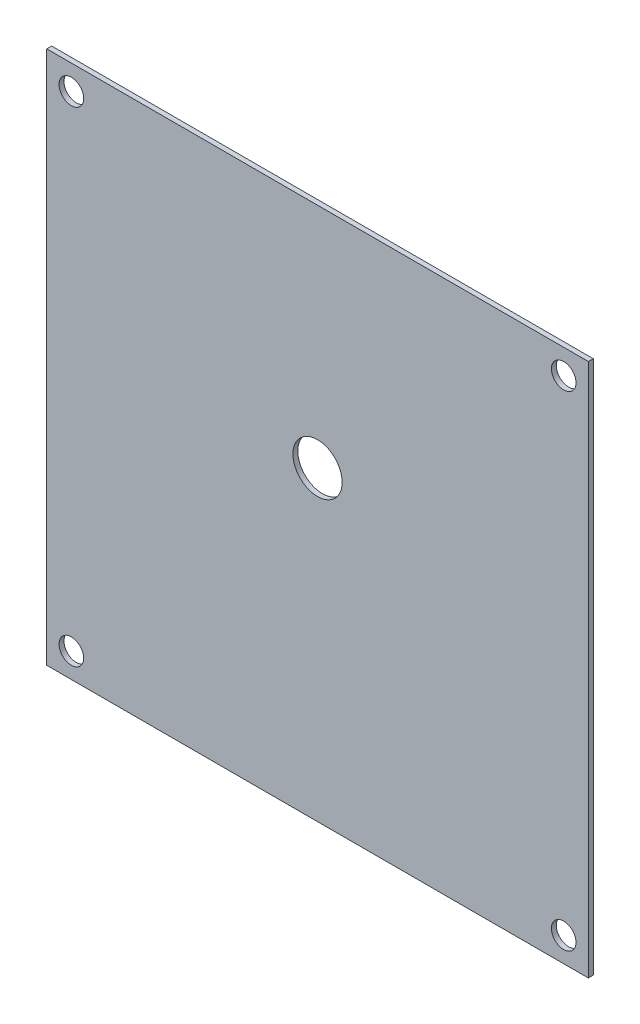
ISO-10303-21;
HEADER;
FILE_DESCRIPTION(('STEP AP214'),'2;1');
FILE_NAME('part.step','',(''),(''),'','','');
FILE_SCHEMA(('AUTOMOTIVE_DESIGN { 1 0 10303 214 1 1 1 1 }'));
ENDSEC;
DATA;
#1=APPLICATION_CONTEXT('core data for automotive mechanical design processes');
#2=APPLICATION_PROTOCOL_DEFINITION('international standard','automotive_design',2000,#1);
#3=PRODUCT_CONTEXT('',#1,'mechanical');
#4=PRODUCT('Part','Part','',(#3));
#5=PRODUCT_RELATED_PRODUCT_CATEGORY('part','',(#4));
#6=PRODUCT_DEFINITION_FORMATION('','',#4);
#7=PRODUCT_DEFINITION_CONTEXT('part definition',#1,'design');
#8=PRODUCT_DEFINITION('design','',#6,#7);
#9=PRODUCT_DEFINITION_SHAPE('','',#8);
#10=(LENGTH_UNIT() NAMED_UNIT(*) SI_UNIT(.MILLI.,.METRE.));
#11=(NAMED_UNIT(*) PLANE_ANGLE_UNIT() SI_UNIT($,.RADIAN.));
#12=(NAMED_UNIT(*) SI_UNIT($,.STERADIAN.) SOLID_ANGLE_UNIT());
#13=UNCERTAINTY_MEASURE_WITH_UNIT(LENGTH_MEASURE(1.E-05),#10,'distance_accuracy_value','');
#14=(GEOMETRIC_REPRESENTATION_CONTEXT(3) GLOBAL_UNCERTAINTY_ASSIGNED_CONTEXT((#13)) GLOBAL_UNIT_ASSIGNED_CONTEXT((#10,
#11,#12)) REPRESENTATION_CONTEXT('',''));
#15=CARTESIAN_POINT('',(0.,0.,0.));
#16=DIRECTION('',(0.,0.,1.));
#17=DIRECTION('',(1.,0.,0.));
#18=AXIS2_PLACEMENT_3D('',#15,#16,#17);
#19=CARTESIAN_POINT('',(0.,0.,2.54));
#20=DIRECTION('',(0.,0.,1.));
#21=DIRECTION('',(1.,0.,0.));
#22=AXIS2_PLACEMENT_3D('',#19,#20,#21);
#23=PLANE('',#22);
#24=CARTESIAN_POINT('',(127.,125.015625,2.54));
#25=DIRECTION('',(0.,0.,1.));
#26=DIRECTION('',(-1.,0.,0.));
#27=AXIS2_PLACEMENT_3D('',#24,#25,#26);
#28=CIRCLE('',#27,6.34999999999999);
#29=CARTESIAN_POINT('',(120.65,125.015625,2.54));
#30=VERTEX_POINT('',#29);
#31=EDGE_CURVE('E135',#30,#30,#28,.T.);
#32=ORIENTED_EDGE('',*,*,#31,.F.);
#33=EDGE_LOOP('',(#32));
#34=FACE_BOUND('',#33,.T.);
#35=CARTESIAN_POINT('',(-127.,-125.015625,2.54));
#36=DIRECTION('',(0.,0.,1.));
#37=DIRECTION('',(-1.,0.,0.));
#38=AXIS2_PLACEMENT_3D('',#35,#36,#37);
#39=CIRCLE('',#38,6.34999999999999);
#40=CARTESIAN_POINT('',(-133.35,-125.015625,2.54));
#41=VERTEX_POINT('',#40);
#42=EDGE_CURVE('E123',#41,#41,#39,.T.);
#43=ORIENTED_EDGE('',*,*,#42,.F.);
#44=EDGE_LOOP('',(#43));
#45=FACE_BOUND('',#44,.T.);
#46=DIRECTION('',(0.,1.,0.));
#47=VECTOR('',#46,1.);
#48=CARTESIAN_POINT('',(139.7,137.715625,2.54));
#49=LINE('',#48,#47);
#50=CARTESIAN_POINT('',(139.7,-137.715625,2.54));
#51=VERTEX_POINT('',#50);
#52=CARTESIAN_POINT('',(139.7,137.715625,2.54));
#53=VERTEX_POINT('',#52);
#54=EDGE_CURVE('E93',#51,#53,#49,.T.);
#55=ORIENTED_EDGE('',*,*,#54,.T.);
#56=DIRECTION('',(-1.,0.,0.));
#57=VECTOR('',#56,1.);
#58=CARTESIAN_POINT('',(-139.7,137.715625,2.54));
#59=LINE('',#58,#57);
#60=CARTESIAN_POINT('',(-139.7,137.715625,2.54));
#61=VERTEX_POINT('',#60);
#62=EDGE_CURVE('E88',#53,#61,#59,.T.);
#63=ORIENTED_EDGE('',*,*,#62,.T.);
#64=DIRECTION('',(0.,-1.,0.));
#65=VECTOR('',#64,1.);
#66=CARTESIAN_POINT('',(-139.7,137.715625,2.54));
#67=LINE('',#66,#65);
#68=CARTESIAN_POINT('',(-139.7,-137.715625,2.54));
#69=VERTEX_POINT('',#68);
#70=EDGE_CURVE('E91',#61,#69,#67,.T.);
#71=ORIENTED_EDGE('',*,*,#70,.T.);
#72=DIRECTION('',(1.,0.,0.));
#73=VECTOR('',#72,1.);
#74=CARTESIAN_POINT('',(-139.7,-137.715625,2.54));
#75=LINE('',#74,#73);
#76=EDGE_CURVE('E58',#69,#51,#75,.T.);
#77=ORIENTED_EDGE('',*,*,#76,.T.);
#78=EDGE_LOOP('',(#55,#63,#71,#77));
#79=FACE_BOUND('',#78,.T.);
#80=CARTESIAN_POINT('',(-127.,125.015625,2.54));
#81=DIRECTION('',(0.,0.,1.));
#82=DIRECTION('',(1.,0.,0.));
#83=AXIS2_PLACEMENT_3D('',#80,#81,#82);
#84=CIRCLE('',#83,6.34999999999999);
#85=CARTESIAN_POINT('',(-120.65,125.015625,2.54));
#86=VERTEX_POINT('',#85);
#87=EDGE_CURVE('E108',#86,#86,#84,.T.);
#88=ORIENTED_EDGE('',*,*,#87,.F.);
#89=EDGE_LOOP('',(#88));
#90=FACE_BOUND('',#89,.T.);
#91=CARTESIAN_POINT('',(127.,-125.015625,2.54));
#92=DIRECTION('',(0.,0.,1.));
#93=DIRECTION('',(1.,0.,0.));
#94=AXIS2_PLACEMENT_3D('',#91,#92,#93);
#95=CIRCLE('',#94,6.34999999999999);
#96=CARTESIAN_POINT('',(133.35,-125.015625,2.54));
#97=VERTEX_POINT('',#96);
#98=EDGE_CURVE('E129',#97,#97,#95,.T.);
#99=ORIENTED_EDGE('',*,*,#98,.F.);
#100=EDGE_LOOP('',(#99));
#101=FACE_BOUND('',#100,.T.);
#102=CARTESIAN_POINT('',(0.,20.240625,2.54));
#103=DIRECTION('',(0.,0.,1.));
#104=DIRECTION('',(1.,0.,0.));
#105=AXIS2_PLACEMENT_3D('',#102,#103,#104);
#106=CIRCLE('',#105,12.7);
#107=CARTESIAN_POINT('',(12.7,20.240625,2.54));
#108=VERTEX_POINT('',#107);
#109=EDGE_CURVE('E141',#108,#108,#106,.T.);
#110=ORIENTED_EDGE('',*,*,#109,.F.);
#111=EDGE_LOOP('',(#110));
#112=FACE_BOUND('',#111,.T.);
#113=ADVANCED_FACE('F41',(#34,#45,#79,#90,#101,#112),#23,.T.);
#114=CARTESIAN_POINT('',(0.,0.,0.));
#115=DIRECTION('',(0.,0.,1.));
#116=DIRECTION('',(1.,0.,0.));
#117=AXIS2_PLACEMENT_3D('',#114,#115,#116);
#118=PLANE('',#117);
#119=DIRECTION('',(0.,1.,0.));
#120=VECTOR('',#119,1.);
#121=CARTESIAN_POINT('',(139.7,137.715625,0.));
#122=LINE('',#121,#120);
#123=CARTESIAN_POINT('',(139.7,-137.715625,0.));
#124=VERTEX_POINT('',#123);
#125=CARTESIAN_POINT('',(139.7,137.715625,0.));
#126=VERTEX_POINT('',#125);
#127=EDGE_CURVE('E105',#124,#126,#122,.T.);
#128=ORIENTED_EDGE('',*,*,#127,.F.);
#129=DIRECTION('',(1.,0.,0.));
#130=VECTOR('',#129,1.);
#131=CARTESIAN_POINT('',(-139.7,-137.715625,0.));
#132=LINE('',#131,#130);
#133=CARTESIAN_POINT('',(-139.7,-137.715625,0.));
#134=VERTEX_POINT('',#133);
#135=EDGE_CURVE('E81',#134,#124,#132,.T.);
#136=ORIENTED_EDGE('',*,*,#135,.F.);
#137=DIRECTION('',(0.,-1.,0.));
#138=VECTOR('',#137,1.);
#139=CARTESIAN_POINT('',(-139.7,137.715625,0.));
#140=LINE('',#139,#138);
#141=CARTESIAN_POINT('',(-139.7,137.715625,0.));
#142=VERTEX_POINT('',#141);
#143=EDGE_CURVE('E75',#142,#134,#140,.T.);
#144=ORIENTED_EDGE('',*,*,#143,.F.);
#145=DIRECTION('',(-1.,0.,0.));
#146=VECTOR('',#145,1.);
#147=CARTESIAN_POINT('',(-139.7,137.715625,0.));
#148=LINE('',#147,#146);
#149=EDGE_CURVE('E97',#126,#142,#148,.T.);
#150=ORIENTED_EDGE('',*,*,#149,.F.);
#151=EDGE_LOOP('',(#128,#136,#144,#150));
#152=FACE_BOUND('',#151,.T.);
#153=CARTESIAN_POINT('',(-127.,125.015625,0.));
#154=DIRECTION('',(0.,0.,1.));
#155=DIRECTION('',(1.,0.,0.));
#156=AXIS2_PLACEMENT_3D('',#153,#154,#155);
#157=CIRCLE('',#156,6.34999999999999);
#158=CARTESIAN_POINT('',(-120.65,125.015625,0.));
#159=VERTEX_POINT('',#158);
#160=EDGE_CURVE('E120',#159,#159,#157,.T.);
#161=ORIENTED_EDGE('',*,*,#160,.T.);
#162=EDGE_LOOP('',(#161));
#163=FACE_BOUND('',#162,.T.);
#164=CARTESIAN_POINT('',(-127.,-125.015625,0.));
#165=DIRECTION('',(0.,0.,1.));
#166=DIRECTION('',(-1.,0.,0.));
#167=AXIS2_PLACEMENT_3D('',#164,#165,#166);
#168=CIRCLE('',#167,6.34999999999999);
#169=CARTESIAN_POINT('',(-133.35,-125.015625,0.));
#170=VERTEX_POINT('',#169);
#171=EDGE_CURVE('E126',#170,#170,#168,.T.);
#172=ORIENTED_EDGE('',*,*,#171,.T.);
#173=EDGE_LOOP('',(#172));
#174=FACE_BOUND('',#173,.T.);
#175=CARTESIAN_POINT('',(127.,-125.015625,0.));
#176=DIRECTION('',(0.,0.,1.));
#177=DIRECTION('',(1.,0.,0.));
#178=AXIS2_PLACEMENT_3D('',#175,#176,#177);
#179=CIRCLE('',#178,6.34999999999999);
#180=CARTESIAN_POINT('',(133.35,-125.015625,0.));
#181=VERTEX_POINT('',#180);
#182=EDGE_CURVE('E132',#181,#181,#179,.T.);
#183=ORIENTED_EDGE('',*,*,#182,.T.);
#184=EDGE_LOOP('',(#183));
#185=FACE_BOUND('',#184,.T.);
#186=CARTESIAN_POINT('',(127.,125.015625,0.));
#187=DIRECTION('',(0.,0.,1.));
#188=DIRECTION('',(-1.,0.,0.));
#189=AXIS2_PLACEMENT_3D('',#186,#187,#188);
#190=CIRCLE('',#189,6.34999999999999);
#191=CARTESIAN_POINT('',(120.65,125.015625,0.));
#192=VERTEX_POINT('',#191);
#193=EDGE_CURVE('E138',#192,#192,#190,.T.);
#194=ORIENTED_EDGE('',*,*,#193,.T.);
#195=EDGE_LOOP('',(#194));
#196=FACE_BOUND('',#195,.T.);
#197=CARTESIAN_POINT('',(0.,20.240625,0.));
#198=DIRECTION('',(0.,0.,1.));
#199=DIRECTION('',(1.,0.,0.));
#200=AXIS2_PLACEMENT_3D('',#197,#198,#199);
#201=CIRCLE('',#200,12.7);
#202=CARTESIAN_POINT('',(12.7,20.240625,0.));
#203=VERTEX_POINT('',#202);
#204=EDGE_CURVE('E144',#203,#203,#201,.T.);
#205=ORIENTED_EDGE('',*,*,#204,.T.);
#206=EDGE_LOOP('',(#205));
#207=FACE_BOUND('',#206,.T.);
#208=ADVANCED_FACE('F116',(#152,#163,#174,#185,#196,#207),#118,.F.);
#209=CARTESIAN_POINT('',(139.7,137.715625,2.54));
#210=DIRECTION('',(-1.,0.,0.));
#211=DIRECTION('',(0.,-1.,0.));
#212=AXIS2_PLACEMENT_3D('',#209,#210,#211);
#213=PLANE('',#212);
#214=ORIENTED_EDGE('',*,*,#127,.T.);
#215=DIRECTION('',(0.,0.,-1.));
#216=VECTOR('',#215,1.);
#217=CARTESIAN_POINT('',(139.7,137.715625,2.54));
#218=LINE('',#217,#216);
#219=EDGE_CURVE('E11',#53,#126,#218,.T.);
#220=ORIENTED_EDGE('',*,*,#219,.F.);
#221=ORIENTED_EDGE('',*,*,#54,.F.);
#222=DIRECTION('',(0.,0.,-1.));
#223=VECTOR('',#222,1.);
#224=CARTESIAN_POINT('',(139.7,-137.715625,2.54));
#225=LINE('',#224,#223);
#226=EDGE_CURVE('E101',#51,#124,#225,.T.);
#227=ORIENTED_EDGE('',*,*,#226,.T.);
#228=EDGE_LOOP('',(#214,#220,#221,#227));
#229=FACE_BOUND('',#228,.T.);
#230=ADVANCED_FACE('F43',(#229),#213,.F.);
#231=CARTESIAN_POINT('',(-139.7,137.715625,2.54));
#232=DIRECTION('',(0.,-1.,0.));
#233=DIRECTION('',(1.,0.,0.));
#234=AXIS2_PLACEMENT_3D('',#231,#232,#233);
#235=PLANE('',#234);
#236=ORIENTED_EDGE('',*,*,#149,.T.);
#237=DIRECTION('',(0.,0.,-1.));
#238=VECTOR('',#237,1.);
#239=CARTESIAN_POINT('',(-139.7,137.715625,2.54));
#240=LINE('',#239,#238);
#241=EDGE_CURVE('E50',#61,#142,#240,.T.);
#242=ORIENTED_EDGE('',*,*,#241,.F.);
#243=ORIENTED_EDGE('',*,*,#62,.F.);
#244=ORIENTED_EDGE('',*,*,#219,.T.);
#245=EDGE_LOOP('',(#236,#242,#243,#244));
#246=FACE_BOUND('',#245,.T.);
#247=ADVANCED_FACE('F96',(#246),#235,.F.);
#248=CARTESIAN_POINT('',(-139.7,137.715625,2.54));
#249=DIRECTION('',(1.,0.,0.));
#250=DIRECTION('',(0.,1.,0.));
#251=AXIS2_PLACEMENT_3D('',#248,#249,#250);
#252=PLANE('',#251);
#253=ORIENTED_EDGE('',*,*,#143,.T.);
#254=DIRECTION('',(0.,0.,-1.));
#255=VECTOR('',#254,1.);
#256=CARTESIAN_POINT('',(-139.7,-137.715625,2.54));
#257=LINE('',#256,#255);
#258=EDGE_CURVE('E98',#69,#134,#257,.T.);
#259=ORIENTED_EDGE('',*,*,#258,.F.);
#260=ORIENTED_EDGE('',*,*,#70,.F.);
#261=ORIENTED_EDGE('',*,*,#241,.T.);
#262=EDGE_LOOP('',(#253,#259,#260,#261));
#263=FACE_BOUND('',#262,.T.);
#264=ADVANCED_FACE('F99',(#263),#252,.F.);
#265=CARTESIAN_POINT('',(-139.7,-137.715625,2.54));
#266=DIRECTION('',(0.,1.,0.));
#267=DIRECTION('',(0.,0.,1.));
#268=AXIS2_PLACEMENT_3D('',#265,#266,#267);
#269=PLANE('',#268);
#270=ORIENTED_EDGE('',*,*,#135,.T.);
#271=ORIENTED_EDGE('',*,*,#226,.F.);
#272=ORIENTED_EDGE('',*,*,#76,.F.);
#273=ORIENTED_EDGE('',*,*,#258,.T.);
#274=EDGE_LOOP('',(#270,#271,#272,#273));
#275=FACE_BOUND('',#274,.T.);
#276=ADVANCED_FACE('F113',(#275),#269,.F.);
#277=CARTESIAN_POINT('',(-127.,125.015625,2.54));
#278=DIRECTION('',(0.,0.,-1.));
#279=DIRECTION('',(-1.,0.,0.));
#280=AXIS2_PLACEMENT_3D('',#277,#278,#279);
#281=CYLINDRICAL_SURFACE('',#280,6.34999999999999);
#282=ORIENTED_EDGE('',*,*,#87,.T.);
#283=EDGE_LOOP('',(#282));
#284=FACE_BOUND('',#283,.T.);
#285=ORIENTED_EDGE('',*,*,#160,.F.);
#286=EDGE_LOOP('',(#285));
#287=FACE_BOUND('',#286,.T.);
#288=ADVANCED_FACE('F163',(#284,#287),#281,.F.);
#289=CARTESIAN_POINT('',(-127.,-125.015625,2.54));
#290=DIRECTION('',(0.,0.,-1.));
#291=DIRECTION('',(-1.,0.,0.));
#292=AXIS2_PLACEMENT_3D('',#289,#290,#291);
#293=CYLINDRICAL_SURFACE('',#292,6.34999999999999);
#294=ORIENTED_EDGE('',*,*,#42,.T.);
#295=EDGE_LOOP('',(#294));
#296=FACE_BOUND('',#295,.T.);
#297=ORIENTED_EDGE('',*,*,#171,.F.);
#298=EDGE_LOOP('',(#297));
#299=FACE_BOUND('',#298,.T.);
#300=ADVANCED_FACE('F217',(#296,#299),#293,.F.);
#301=CARTESIAN_POINT('',(127.,-125.015625,2.54));
#302=DIRECTION('',(0.,0.,-1.));
#303=DIRECTION('',(-1.,0.,0.));
#304=AXIS2_PLACEMENT_3D('',#301,#302,#303);
#305=CYLINDRICAL_SURFACE('',#304,6.34999999999999);
#306=ORIENTED_EDGE('',*,*,#98,.T.);
#307=EDGE_LOOP('',(#306));
#308=FACE_BOUND('',#307,.T.);
#309=ORIENTED_EDGE('',*,*,#182,.F.);
#310=EDGE_LOOP('',(#309));
#311=FACE_BOUND('',#310,.T.);
#312=ADVANCED_FACE('F226',(#308,#311),#305,.F.);
#313=CARTESIAN_POINT('',(127.,125.015625,2.54));
#314=DIRECTION('',(0.,0.,-1.));
#315=DIRECTION('',(-1.,0.,0.));
#316=AXIS2_PLACEMENT_3D('',#313,#314,#315);
#317=CYLINDRICAL_SURFACE('',#316,6.34999999999999);
#318=ORIENTED_EDGE('',*,*,#31,.T.);
#319=EDGE_LOOP('',(#318));
#320=FACE_BOUND('',#319,.T.);
#321=ORIENTED_EDGE('',*,*,#193,.F.);
#322=EDGE_LOOP('',(#321));
#323=FACE_BOUND('',#322,.T.);
#324=ADVANCED_FACE('F235',(#320,#323),#317,.F.);
#325=CARTESIAN_POINT('',(0.,20.240625,2.54));
#326=DIRECTION('',(0.,0.,-1.));
#327=DIRECTION('',(-1.,0.,0.));
#328=AXIS2_PLACEMENT_3D('',#325,#326,#327);
#329=CYLINDRICAL_SURFACE('',#328,12.7);
#330=ORIENTED_EDGE('',*,*,#109,.T.);
#331=EDGE_LOOP('',(#330));
#332=FACE_BOUND('',#331,.T.);
#333=ORIENTED_EDGE('',*,*,#204,.F.);
#334=EDGE_LOOP('',(#333));
#335=FACE_BOUND('',#334,.T.);
#336=ADVANCED_FACE('F150',(#332,#335),#329,.F.);
#337=CLOSED_SHELL('',(#113,#208,#230,#247,#264,#276,#288,#300,#312,#324,#336));
#338=MANIFOLD_SOLID_BREP('B2',#337);
#339=ADVANCED_BREP_SHAPE_REPRESENTATION('',(#18,#338),#14);
#340=SHAPE_DEFINITION_REPRESENTATION(#9,#339);
ENDSEC;
END-ISO-10303-21;
